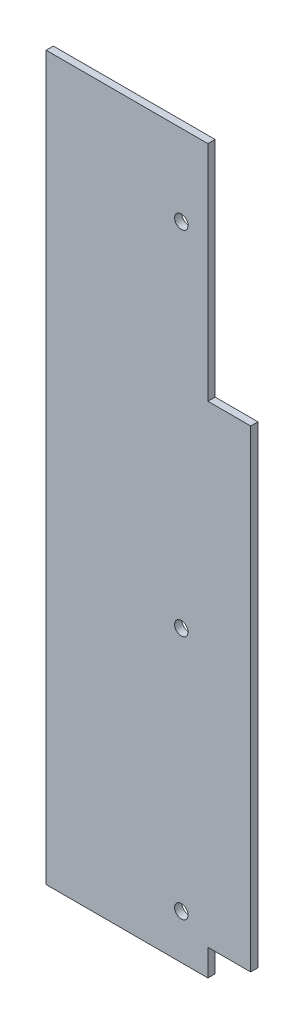
ISO-10303-21;
HEADER;
FILE_DESCRIPTION(('STEP AP214'),'2;1');
FILE_NAME('part.step','',(''),(''),'','','');
FILE_SCHEMA(('AUTOMOTIVE_DESIGN { 1 0 10303 214 1 1 1 1 }'));
ENDSEC;
DATA;
#1=APPLICATION_CONTEXT('core data for automotive mechanical design processes');
#2=APPLICATION_PROTOCOL_DEFINITION('international standard','automotive_design',2000,#1);
#3=PRODUCT_CONTEXT('',#1,'mechanical');
#4=PRODUCT('Part','Part','',(#3));
#5=PRODUCT_RELATED_PRODUCT_CATEGORY('part','',(#4));
#6=PRODUCT_DEFINITION_FORMATION('','',#4);
#7=PRODUCT_DEFINITION_CONTEXT('part definition',#1,'design');
#8=PRODUCT_DEFINITION('design','',#6,#7);
#9=PRODUCT_DEFINITION_SHAPE('','',#8);
#10=(LENGTH_UNIT() NAMED_UNIT(*) SI_UNIT(.MILLI.,.METRE.));
#11=(NAMED_UNIT(*) PLANE_ANGLE_UNIT() SI_UNIT($,.RADIAN.));
#12=(NAMED_UNIT(*) SI_UNIT($,.STERADIAN.) SOLID_ANGLE_UNIT());
#13=UNCERTAINTY_MEASURE_WITH_UNIT(LENGTH_MEASURE(1.E-05),#10,'distance_accuracy_value','');
#14=(GEOMETRIC_REPRESENTATION_CONTEXT(3) GLOBAL_UNCERTAINTY_ASSIGNED_CONTEXT((#13)) GLOBAL_UNIT_ASSIGNED_CONTEXT((#10,
#11,#12)) REPRESENTATION_CONTEXT('',''));
#15=CARTESIAN_POINT('',(0.,0.,0.));
#16=DIRECTION('',(0.,0.,1.));
#17=DIRECTION('',(1.,0.,0.));
#18=AXIS2_PLACEMENT_3D('',#15,#16,#17);
#19=CARTESIAN_POINT('',(35.56,0.,1.5875));
#20=DIRECTION('',(-1.,0.,0.));
#21=DIRECTION('',(0.,0.,1.));
#22=AXIS2_PLACEMENT_3D('',#19,#20,#21);
#23=PLANE('',#22);
#24=DIRECTION('',(0.,0.,1.));
#25=VECTOR('',#24,1.);
#26=CARTESIAN_POINT('',(35.56,109.728,1.5875));
#27=LINE('',#26,#25);
#28=CARTESIAN_POINT('',(35.56,109.728,0.));
#29=VERTEX_POINT('',#28);
#30=CARTESIAN_POINT('',(35.56,109.728,1.5875));
#31=VERTEX_POINT('',#30);
#32=EDGE_CURVE('E153',#29,#31,#27,.T.);
#33=ORIENTED_EDGE('',*,*,#32,.F.);
#34=DIRECTION('',(0.,1.,0.));
#35=VECTOR('',#34,1.);
#36=CARTESIAN_POINT('',(35.56,0.,0.));
#37=LINE('',#36,#35);
#38=CARTESIAN_POINT('',(35.56,158.75,0.));
#39=VERTEX_POINT('',#38);
#40=EDGE_CURVE('E195',#29,#39,#37,.T.);
#41=ORIENTED_EDGE('',*,*,#40,.T.);
#42=DIRECTION('',(0.,0.,-1.));
#43=VECTOR('',#42,1.);
#44=CARTESIAN_POINT('',(35.56,158.75,0.));
#45=LINE('',#44,#43);
#46=CARTESIAN_POINT('',(35.56,158.75,1.5875));
#47=VERTEX_POINT('',#46);
#48=EDGE_CURVE('E121',#47,#39,#45,.T.);
#49=ORIENTED_EDGE('',*,*,#48,.F.);
#50=DIRECTION('',(0.,1.,0.));
#51=VECTOR('',#50,1.);
#52=CARTESIAN_POINT('',(35.56,0.,1.5875));
#53=LINE('',#52,#51);
#54=EDGE_CURVE('E54',#31,#47,#53,.T.);
#55=ORIENTED_EDGE('',*,*,#54,.F.);
#56=EDGE_LOOP('',(#33,#41,#49,#55));
#57=FACE_BOUND('',#56,.T.);
#58=ADVANCED_FACE('F37',(#57),#23,.F.);
#59=DIRECTION('',(0.,0.,-1.));
#60=VECTOR('',#59,1.);
#61=CARTESIAN_POINT('',(35.56,5.842,1.5875));
#62=LINE('',#61,#60);
#63=CARTESIAN_POINT('',(35.56,5.842,1.5875));
#64=VERTEX_POINT('',#63);
#65=CARTESIAN_POINT('',(35.56,5.842,0.));
#66=VERTEX_POINT('',#65);
#67=EDGE_CURVE('E62',#64,#66,#62,.T.);
#68=ORIENTED_EDGE('',*,*,#67,.F.);
#69=CARTESIAN_POINT('',(35.56,0.,1.5875));
#70=VERTEX_POINT('',#69);
#71=EDGE_CURVE('E113',#70,#64,#53,.T.);
#72=ORIENTED_EDGE('',*,*,#71,.F.);
#73=DIRECTION('',(0.,0.,-1.));
#74=VECTOR('',#73,1.);
#75=CARTESIAN_POINT('',(35.56,0.,1.5875));
#76=LINE('',#75,#74);
#77=CARTESIAN_POINT('',(35.56,0.,0.));
#78=VERTEX_POINT('',#77);
#79=EDGE_CURVE('E11',#70,#78,#76,.T.);
#80=ORIENTED_EDGE('',*,*,#79,.T.);
#81=EDGE_CURVE('E196',#78,#66,#37,.T.);
#82=ORIENTED_EDGE('',*,*,#81,.T.);
#83=EDGE_LOOP('',(#68,#72,#80,#82));
#84=FACE_BOUND('',#83,.T.);
#85=ADVANCED_FACE('F211',(#84),#23,.F.);
#86=CARTESIAN_POINT('',(0.,0.,1.5875));
#87=DIRECTION('',(0.,1.,0.));
#88=DIRECTION('',(0.,0.,1.));
#89=AXIS2_PLACEMENT_3D('',#86,#87,#88);
#90=PLANE('',#89);
#91=DIRECTION('',(1.,0.,0.));
#92=VECTOR('',#91,1.);
#93=CARTESIAN_POINT('',(0.,0.,0.));
#94=LINE('',#93,#92);
#95=CARTESIAN_POINT('',(0.,0.,0.));
#96=VERTEX_POINT('',#95);
#97=EDGE_CURVE('E178',#96,#78,#94,.T.);
#98=ORIENTED_EDGE('',*,*,#97,.T.);
#99=ORIENTED_EDGE('',*,*,#79,.F.);
#100=DIRECTION('',(1.,0.,0.));
#101=VECTOR('',#100,1.);
#102=CARTESIAN_POINT('',(0.,0.,1.5875));
#103=LINE('',#102,#101);
#104=CARTESIAN_POINT('',(0.,0.,1.5875));
#105=VERTEX_POINT('',#104);
#106=EDGE_CURVE('E207',#105,#70,#103,.T.);
#107=ORIENTED_EDGE('',*,*,#106,.F.);
#108=DIRECTION('',(0.,0.,-1.));
#109=VECTOR('',#108,1.);
#110=CARTESIAN_POINT('',(0.,0.,1.5875));
#111=LINE('',#110,#109);
#112=EDGE_CURVE('E46',#105,#96,#111,.T.);
#113=ORIENTED_EDGE('',*,*,#112,.T.);
#114=EDGE_LOOP('',(#98,#99,#107,#113));
#115=FACE_BOUND('',#114,.T.);
#116=ADVANCED_FACE('F39',(#115),#90,.F.);
#117=CARTESIAN_POINT('',(0.,0.,1.5875));
#118=DIRECTION('',(1.,0.,0.));
#119=DIRECTION('',(0.,0.,-1.));
#120=AXIS2_PLACEMENT_3D('',#117,#118,#119);
#121=PLANE('',#120);
#122=DIRECTION('',(0.,-1.,0.));
#123=VECTOR('',#122,1.);
#124=CARTESIAN_POINT('',(0.,0.,0.));
#125=LINE('',#124,#123);
#126=CARTESIAN_POINT('',(0.,158.75,0.));
#127=VERTEX_POINT('',#126);
#128=EDGE_CURVE('E198',#127,#96,#125,.T.);
#129=ORIENTED_EDGE('',*,*,#128,.T.);
#130=ORIENTED_EDGE('',*,*,#112,.F.);
#131=DIRECTION('',(0.,-1.,0.));
#132=VECTOR('',#131,1.);
#133=CARTESIAN_POINT('',(0.,0.,1.5875));
#134=LINE('',#133,#132);
#135=CARTESIAN_POINT('',(0.,158.75,1.5875));
#136=VERTEX_POINT('',#135);
#137=EDGE_CURVE('E104',#136,#105,#134,.T.);
#138=ORIENTED_EDGE('',*,*,#137,.F.);
#139=DIRECTION('',(0.,0.,1.));
#140=VECTOR('',#139,1.);
#141=CARTESIAN_POINT('',(0.,158.75,0.));
#142=LINE('',#141,#140);
#143=EDGE_CURVE('E108',#127,#136,#142,.T.);
#144=ORIENTED_EDGE('',*,*,#143,.F.);
#145=EDGE_LOOP('',(#129,#130,#138,#144));
#146=FACE_BOUND('',#145,.T.);
#147=ADVANCED_FACE('F106',(#146),#121,.F.);
#148=CARTESIAN_POINT('',(35.56,0.,1.5875));
#149=DIRECTION('',(0.,0.,1.));
#150=DIRECTION('',(1.,0.,0.));
#151=AXIS2_PLACEMENT_3D('',#148,#149,#150);
#152=PLANE('',#151);
#153=CARTESIAN_POINT('',(29.718,9.77899999999998,1.5875));
#154=DIRECTION('',(0.,0.,1.));
#155=DIRECTION('',(1.,0.,0.));
#156=AXIS2_PLACEMENT_3D('',#153,#154,#155);
#157=CIRCLE('',#156,1.4732);
#158=CARTESIAN_POINT('',(31.1912,9.77899999999998,1.5875));
#159=VERTEX_POINT('',#158);
#160=EDGE_CURVE('E131',#159,#159,#157,.T.);
#161=ORIENTED_EDGE('',*,*,#160,.F.);
#162=EDGE_LOOP('',(#161));
#163=FACE_BOUND('',#162,.T.);
#164=CARTESIAN_POINT('',(29.718,63.627,1.5875));
#165=DIRECTION('',(0.,0.,1.));
#166=DIRECTION('',(1.,0.,0.));
#167=AXIS2_PLACEMENT_3D('',#164,#165,#166);
#168=CIRCLE('',#167,1.4732);
#169=CARTESIAN_POINT('',(31.1912,63.627,1.5875));
#170=VERTEX_POINT('',#169);
#171=EDGE_CURVE('E137',#170,#170,#168,.T.);
#172=ORIENTED_EDGE('',*,*,#171,.F.);
#173=EDGE_LOOP('',(#172));
#174=FACE_BOUND('',#173,.T.);
#175=CARTESIAN_POINT('',(29.718,140.97,1.5875));
#176=DIRECTION('',(0.,0.,1.));
#177=DIRECTION('',(1.,0.,0.));
#178=AXIS2_PLACEMENT_3D('',#175,#176,#177);
#179=CIRCLE('',#178,1.4732);
#180=CARTESIAN_POINT('',(31.1912,140.97,1.5875));
#181=VERTEX_POINT('',#180);
#182=EDGE_CURVE('E143',#181,#181,#179,.T.);
#183=ORIENTED_EDGE('',*,*,#182,.F.);
#184=EDGE_LOOP('',(#183));
#185=FACE_BOUND('',#184,.T.);
#186=ORIENTED_EDGE('',*,*,#106,.T.);
#187=ORIENTED_EDGE('',*,*,#71,.T.);
#188=DIRECTION('',(-1.,0.,0.));
#189=VECTOR('',#188,1.);
#190=CARTESIAN_POINT('',(44.958,5.842,1.5875));
#191=LINE('',#190,#189);
#192=CARTESIAN_POINT('',(44.958,5.842,1.5875));
#193=VERTEX_POINT('',#192);
#194=EDGE_CURVE('E172',#193,#64,#191,.T.);
#195=ORIENTED_EDGE('',*,*,#194,.F.);
#196=DIRECTION('',(0.,-1.,0.));
#197=VECTOR('',#196,1.);
#198=CARTESIAN_POINT('',(44.958,5.842,1.5875));
#199=LINE('',#198,#197);
#200=CARTESIAN_POINT('',(44.958,109.728,1.5875));
#201=VERTEX_POINT('',#200);
#202=EDGE_CURVE('E149',#201,#193,#199,.T.);
#203=ORIENTED_EDGE('',*,*,#202,.F.);
#204=DIRECTION('',(-1.,0.,0.));
#205=VECTOR('',#204,1.);
#206=CARTESIAN_POINT('',(44.958,109.728,1.5875));
#207=LINE('',#206,#205);
#208=EDGE_CURVE('E159',#201,#31,#207,.T.);
#209=ORIENTED_EDGE('',*,*,#208,.T.);
#210=ORIENTED_EDGE('',*,*,#54,.T.);
#211=DIRECTION('',(1.,0.,0.));
#212=VECTOR('',#211,1.);
#213=CARTESIAN_POINT('',(0.,158.75,1.5875));
#214=LINE('',#213,#212);
#215=EDGE_CURVE('E116',#136,#47,#214,.T.);
#216=ORIENTED_EDGE('',*,*,#215,.F.);
#217=ORIENTED_EDGE('',*,*,#137,.T.);
#218=EDGE_LOOP('',(#186,#187,#195,#203,#209,#210,#216,#217));
#219=FACE_BOUND('',#218,.T.);
#220=ADVANCED_FACE('F117',(#163,#174,#185,#219),#152,.T.);
#221=CARTESIAN_POINT('',(35.56,0.,0.));
#222=DIRECTION('',(0.,0.,1.));
#223=DIRECTION('',(1.,0.,0.));
#224=AXIS2_PLACEMENT_3D('',#221,#222,#223);
#225=PLANE('',#224);
#226=CARTESIAN_POINT('',(29.718,9.77899999999998,0.));
#227=DIRECTION('',(0.,0.,1.));
#228=DIRECTION('',(1.,0.,0.));
#229=AXIS2_PLACEMENT_3D('',#226,#227,#228);
#230=CIRCLE('',#229,1.4732);
#231=CARTESIAN_POINT('',(31.1912,9.77899999999998,0.));
#232=VERTEX_POINT('',#231);
#233=EDGE_CURVE('E134',#232,#232,#230,.T.);
#234=ORIENTED_EDGE('',*,*,#233,.T.);
#235=EDGE_LOOP('',(#234));
#236=FACE_BOUND('',#235,.T.);
#237=CARTESIAN_POINT('',(29.718,63.627,0.));
#238=DIRECTION('',(0.,0.,1.));
#239=DIRECTION('',(1.,0.,0.));
#240=AXIS2_PLACEMENT_3D('',#237,#238,#239);
#241=CIRCLE('',#240,1.4732);
#242=CARTESIAN_POINT('',(31.1912,63.627,0.));
#243=VERTEX_POINT('',#242);
#244=EDGE_CURVE('E140',#243,#243,#241,.T.);
#245=ORIENTED_EDGE('',*,*,#244,.T.);
#246=EDGE_LOOP('',(#245));
#247=FACE_BOUND('',#246,.T.);
#248=CARTESIAN_POINT('',(29.718,140.97,0.));
#249=DIRECTION('',(0.,0.,1.));
#250=DIRECTION('',(1.,0.,0.));
#251=AXIS2_PLACEMENT_3D('',#248,#249,#250);
#252=CIRCLE('',#251,1.4732);
#253=CARTESIAN_POINT('',(31.1912,140.97,0.));
#254=VERTEX_POINT('',#253);
#255=EDGE_CURVE('E146',#254,#254,#252,.T.);
#256=ORIENTED_EDGE('',*,*,#255,.T.);
#257=EDGE_LOOP('',(#256));
#258=FACE_BOUND('',#257,.T.);
#259=ORIENTED_EDGE('',*,*,#97,.F.);
#260=ORIENTED_EDGE('',*,*,#128,.F.);
#261=DIRECTION('',(-1.,0.,0.));
#262=VECTOR('',#261,1.);
#263=CARTESIAN_POINT('',(0.,158.75,0.));
#264=LINE('',#263,#262);
#265=EDGE_CURVE('E126',#39,#127,#264,.T.);
#266=ORIENTED_EDGE('',*,*,#265,.F.);
#267=ORIENTED_EDGE('',*,*,#40,.F.);
#268=DIRECTION('',(-1.,0.,0.));
#269=VECTOR('',#268,1.);
#270=CARTESIAN_POINT('',(44.958,109.728,0.));
#271=LINE('',#270,#269);
#272=CARTESIAN_POINT('',(44.958,109.728,0.));
#273=VERTEX_POINT('',#272);
#274=EDGE_CURVE('E173',#273,#29,#271,.T.);
#275=ORIENTED_EDGE('',*,*,#274,.F.);
#276=DIRECTION('',(0.,1.,0.));
#277=VECTOR('',#276,1.);
#278=CARTESIAN_POINT('',(44.958,5.842,0.));
#279=LINE('',#278,#277);
#280=CARTESIAN_POINT('',(44.958,5.842,0.));
#281=VERTEX_POINT('',#280);
#282=EDGE_CURVE('E155',#281,#273,#279,.T.);
#283=ORIENTED_EDGE('',*,*,#282,.F.);
#284=DIRECTION('',(-1.,0.,0.));
#285=VECTOR('',#284,1.);
#286=CARTESIAN_POINT('',(44.958,5.842,0.));
#287=LINE('',#286,#285);
#288=EDGE_CURVE('E169',#281,#66,#287,.T.);
#289=ORIENTED_EDGE('',*,*,#288,.T.);
#290=ORIENTED_EDGE('',*,*,#81,.F.);
#291=EDGE_LOOP('',(#259,#260,#266,#267,#275,#283,#289,#290));
#292=FACE_BOUND('',#291,.T.);
#293=ADVANCED_FACE('F194',(#236,#247,#258,#292),#225,.F.);
#294=CARTESIAN_POINT('',(44.958,5.842,1.5875));
#295=DIRECTION('',(0.,1.,0.));
#296=DIRECTION('',(0.,0.,1.));
#297=AXIS2_PLACEMENT_3D('',#294,#295,#296);
#298=PLANE('',#297);
#299=ORIENTED_EDGE('',*,*,#67,.T.);
#300=ORIENTED_EDGE('',*,*,#288,.F.);
#301=DIRECTION('',(0.,0.,-1.));
#302=VECTOR('',#301,1.);
#303=CARTESIAN_POINT('',(44.958,5.842,1.5875));
#304=LINE('',#303,#302);
#305=EDGE_CURVE('E152',#193,#281,#304,.T.);
#306=ORIENTED_EDGE('',*,*,#305,.F.);
#307=ORIENTED_EDGE('',*,*,#194,.T.);
#308=EDGE_LOOP('',(#299,#300,#306,#307));
#309=FACE_BOUND('',#308,.T.);
#310=ADVANCED_FACE('F217',(#309),#298,.F.);
#311=CARTESIAN_POINT('',(44.958,109.728,1.5875));
#312=DIRECTION('',(0.,-1.,0.));
#313=DIRECTION('',(0.,0.,-1.));
#314=AXIS2_PLACEMENT_3D('',#311,#312,#313);
#315=PLANE('',#314);
#316=ORIENTED_EDGE('',*,*,#32,.T.);
#317=ORIENTED_EDGE('',*,*,#208,.F.);
#318=DIRECTION('',(0.,0.,1.));
#319=VECTOR('',#318,1.);
#320=CARTESIAN_POINT('',(44.958,109.728,1.5875));
#321=LINE('',#320,#319);
#322=EDGE_CURVE('E157',#273,#201,#321,.T.);
#323=ORIENTED_EDGE('',*,*,#322,.F.);
#324=ORIENTED_EDGE('',*,*,#274,.T.);
#325=EDGE_LOOP('',(#316,#317,#323,#324));
#326=FACE_BOUND('',#325,.T.);
#327=ADVANCED_FACE('F188',(#326),#315,.F.);
#328=CARTESIAN_POINT('',(44.958,109.728,1.5875));
#329=DIRECTION('',(-1.,0.,0.));
#330=DIRECTION('',(0.,0.,1.));
#331=AXIS2_PLACEMENT_3D('',#328,#329,#330);
#332=PLANE('',#331);
#333=ORIENTED_EDGE('',*,*,#202,.T.);
#334=ORIENTED_EDGE('',*,*,#305,.T.);
#335=ORIENTED_EDGE('',*,*,#282,.T.);
#336=ORIENTED_EDGE('',*,*,#322,.T.);
#337=EDGE_LOOP('',(#333,#334,#335,#336));
#338=FACE_BOUND('',#337,.T.);
#339=ADVANCED_FACE('F219',(#338),#332,.F.);
#340=CARTESIAN_POINT('',(29.718,140.97,1.5875));
#341=DIRECTION('',(0.,0.,1.));
#342=DIRECTION('',(1.,0.,0.));
#343=AXIS2_PLACEMENT_3D('',#340,#341,#342);
#344=CYLINDRICAL_SURFACE('',#343,1.4732);
#345=ORIENTED_EDGE('',*,*,#182,.T.);
#346=EDGE_LOOP('',(#345));
#347=FACE_BOUND('',#346,.T.);
#348=ORIENTED_EDGE('',*,*,#255,.F.);
#349=EDGE_LOOP('',(#348));
#350=FACE_BOUND('',#349,.T.);
#351=ADVANCED_FACE('F221',(#347,#350),#344,.F.);
#352=CARTESIAN_POINT('',(29.718,63.627,1.5875));
#353=DIRECTION('',(0.,0.,1.));
#354=DIRECTION('',(1.,0.,0.));
#355=AXIS2_PLACEMENT_3D('',#352,#353,#354);
#356=CYLINDRICAL_SURFACE('',#355,1.4732);
#357=ORIENTED_EDGE('',*,*,#171,.T.);
#358=EDGE_LOOP('',(#357));
#359=FACE_BOUND('',#358,.T.);
#360=ORIENTED_EDGE('',*,*,#244,.F.);
#361=EDGE_LOOP('',(#360));
#362=FACE_BOUND('',#361,.T.);
#363=ADVANCED_FACE('F227',(#359,#362),#356,.F.);
#364=CARTESIAN_POINT('',(29.718,9.77899999999998,1.5875));
#365=DIRECTION('',(0.,0.,1.));
#366=DIRECTION('',(1.,0.,0.));
#367=AXIS2_PLACEMENT_3D('',#364,#365,#366);
#368=CYLINDRICAL_SURFACE('',#367,1.4732);
#369=ORIENTED_EDGE('',*,*,#160,.T.);
#370=EDGE_LOOP('',(#369));
#371=FACE_BOUND('',#370,.T.);
#372=ORIENTED_EDGE('',*,*,#233,.F.);
#373=EDGE_LOOP('',(#372));
#374=FACE_BOUND('',#373,.T.);
#375=ADVANCED_FACE('F273',(#371,#374),#368,.F.);
#376=CARTESIAN_POINT('',(0.,158.75,1.5875));
#377=DIRECTION('',(0.,1.,0.));
#378=DIRECTION('',(0.,0.,1.));
#379=AXIS2_PLACEMENT_3D('',#376,#377,#378);
#380=PLANE('',#379);
#381=ORIENTED_EDGE('',*,*,#143,.T.);
#382=ORIENTED_EDGE('',*,*,#215,.T.);
#383=ORIENTED_EDGE('',*,*,#48,.T.);
#384=ORIENTED_EDGE('',*,*,#265,.T.);
#385=EDGE_LOOP('',(#381,#382,#383,#384));
#386=FACE_BOUND('',#385,.T.);
#387=ADVANCED_FACE('F124',(#386),#380,.T.);
#388=CLOSED_SHELL('',(#58,#85,#116,#147,#220,#293,#310,#327,#339,#351,#363,#375,#387));
#389=MANIFOLD_SOLID_BREP('B2',#388);
#390=ADVANCED_BREP_SHAPE_REPRESENTATION('',(#18,#389),#14);
#391=SHAPE_DEFINITION_REPRESENTATION(#9,#390);
ENDSEC;
END-ISO-10303-21;
